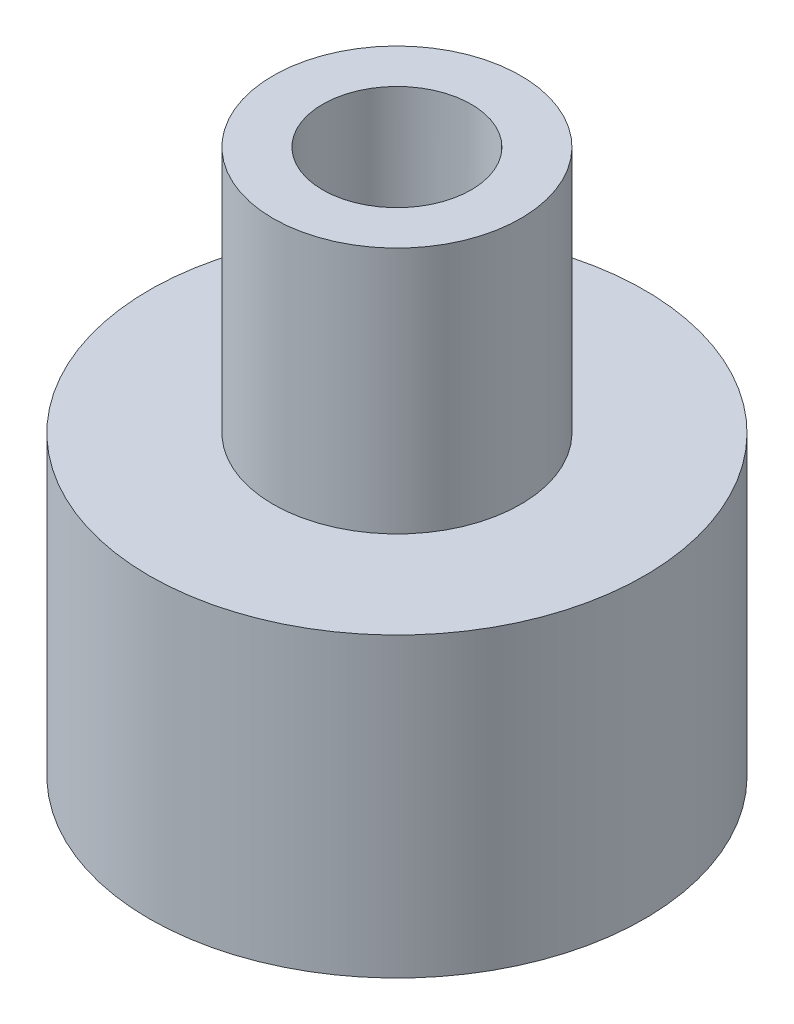
ISO-10303-21;
HEADER;
FILE_DESCRIPTION(('STEP AP214'),'2;1');
FILE_NAME('part.step','',(''),(''),'','','');
FILE_SCHEMA(('AUTOMOTIVE_DESIGN { 1 0 10303 214 1 1 1 1 }'));
ENDSEC;
DATA;
#1=APPLICATION_CONTEXT('core data for automotive mechanical design processes');
#2=APPLICATION_PROTOCOL_DEFINITION('international standard','automotive_design',2000,#1);
#3=PRODUCT_CONTEXT('',#1,'mechanical');
#4=PRODUCT('Part','Part','',(#3));
#5=PRODUCT_RELATED_PRODUCT_CATEGORY('part','',(#4));
#6=PRODUCT_DEFINITION_FORMATION('','',#4);
#7=PRODUCT_DEFINITION_CONTEXT('part definition',#1,'design');
#8=PRODUCT_DEFINITION('design','',#6,#7);
#9=PRODUCT_DEFINITION_SHAPE('','',#8);
#10=(LENGTH_UNIT() NAMED_UNIT(*) SI_UNIT(.MILLI.,.METRE.));
#11=(NAMED_UNIT(*) PLANE_ANGLE_UNIT() SI_UNIT($,.RADIAN.));
#12=(NAMED_UNIT(*) SI_UNIT($,.STERADIAN.) SOLID_ANGLE_UNIT());
#13=UNCERTAINTY_MEASURE_WITH_UNIT(LENGTH_MEASURE(1.E-05),#10,'distance_accuracy_value','');
#14=(GEOMETRIC_REPRESENTATION_CONTEXT(3) GLOBAL_UNCERTAINTY_ASSIGNED_CONTEXT((#13)) GLOBAL_UNIT_ASSIGNED_CONTEXT((#10,
#11,#12)) REPRESENTATION_CONTEXT('',''));
#15=CARTESIAN_POINT('',(0.,0.,0.));
#16=DIRECTION('',(0.,0.,1.));
#17=DIRECTION('',(1.,0.,0.));
#18=AXIS2_PLACEMENT_3D('',#15,#16,#17);
#19=CARTESIAN_POINT('',(0.,6.,0.));
#20=DIRECTION('',(0.,-1.,0.));
#21=DIRECTION('',(0.,0.,-1.));
#22=AXIS2_PLACEMENT_3D('',#19,#20,#21);
#23=CYLINDRICAL_SURFACE('',#22,5.);
#24=CARTESIAN_POINT('',(0.,6.,0.));
#25=DIRECTION('',(0.,1.,0.));
#26=DIRECTION('',(0.,0.,1.));
#27=AXIS2_PLACEMENT_3D('',#24,#25,#26);
#28=CIRCLE('',#27,5.);
#29=CARTESIAN_POINT('',(0.,6.,5.));
#30=VERTEX_POINT('',#29);
#31=EDGE_CURVE('E37',#30,#30,#28,.T.);
#32=ORIENTED_EDGE('',*,*,#31,.F.);
#33=EDGE_LOOP('',(#32));
#34=FACE_BOUND('',#33,.T.);
#35=CARTESIAN_POINT('',(0.,0.,0.));
#36=DIRECTION('',(0.,1.,0.));
#37=DIRECTION('',(0.,0.,1.));
#38=AXIS2_PLACEMENT_3D('',#35,#36,#37);
#39=CIRCLE('',#38,5.);
#40=CARTESIAN_POINT('',(0.,0.,5.));
#41=VERTEX_POINT('',#40);
#42=EDGE_CURVE('E41',#41,#41,#39,.T.);
#43=ORIENTED_EDGE('',*,*,#42,.T.);
#44=EDGE_LOOP('',(#43));
#45=FACE_BOUND('',#44,.T.);
#46=ADVANCED_FACE('F31',(#34,#45),#23,.T.);
#47=CARTESIAN_POINT('',(0.,6.,0.));
#48=DIRECTION('',(0.,1.,0.));
#49=DIRECTION('',(0.,0.,1.));
#50=AXIS2_PLACEMENT_3D('',#47,#48,#49);
#51=PLANE('',#50);
#52=CARTESIAN_POINT('',(0.,6.,0.));
#53=DIRECTION('',(0.,1.,0.));
#54=DIRECTION('',(0.,0.,1.));
#55=AXIS2_PLACEMENT_3D('',#52,#53,#54);
#56=CIRCLE('',#55,2.5);
#57=CARTESIAN_POINT('',(0.,6.,2.5));
#58=VERTEX_POINT('',#57);
#59=EDGE_CURVE('E10',#58,#58,#56,.T.);
#60=ORIENTED_EDGE('',*,*,#59,.F.);
#61=EDGE_LOOP('',(#60));
#62=FACE_BOUND('',#61,.T.);
#63=ORIENTED_EDGE('',*,*,#31,.T.);
#64=EDGE_LOOP('',(#63));
#65=FACE_BOUND('',#64,.T.);
#66=ADVANCED_FACE('F76',(#62,#65),#51,.T.);
#67=CARTESIAN_POINT('',(0.,0.,0.));
#68=DIRECTION('',(0.,1.,0.));
#69=DIRECTION('',(0.,0.,1.));
#70=AXIS2_PLACEMENT_3D('',#67,#68,#69);
#71=PLANE('',#70);
#72=CARTESIAN_POINT('',(0.,0.,0.));
#73=DIRECTION('',(0.,-1.,0.));
#74=DIRECTION('',(0.,0.,-1.));
#75=AXIS2_PLACEMENT_3D('',#72,#73,#74);
#76=CIRCLE('',#75,2.55);
#77=CARTESIAN_POINT('',(0.,0.,-2.55));
#78=VERTEX_POINT('',#77);
#79=EDGE_CURVE('E57',#78,#78,#76,.T.);
#80=ORIENTED_EDGE('',*,*,#79,.F.);
#81=EDGE_LOOP('',(#80));
#82=FACE_BOUND('',#81,.T.);
#83=ORIENTED_EDGE('',*,*,#42,.F.);
#84=EDGE_LOOP('',(#83));
#85=FACE_BOUND('',#84,.T.);
#86=ADVANCED_FACE('F72',(#82,#85),#71,.F.);
#87=CARTESIAN_POINT('',(0.,5.,0.));
#88=DIRECTION('',(0.,1.,0.));
#89=DIRECTION('',(0.,0.,1.));
#90=AXIS2_PLACEMENT_3D('',#87,#88,#89);
#91=CYLINDRICAL_SURFACE('',#90,2.5);
#92=ORIENTED_EDGE('',*,*,#59,.T.);
#93=EDGE_LOOP('',(#92));
#94=FACE_BOUND('',#93,.T.);
#95=CARTESIAN_POINT('',(0.,11.,0.));
#96=DIRECTION('',(0.,1.,0.));
#97=DIRECTION('',(0.,0.,1.));
#98=AXIS2_PLACEMENT_3D('',#95,#96,#97);
#99=CIRCLE('',#98,2.5);
#100=CARTESIAN_POINT('',(0.,11.,2.5));
#101=VERTEX_POINT('',#100);
#102=EDGE_CURVE('E46',#101,#101,#99,.T.);
#103=ORIENTED_EDGE('',*,*,#102,.F.);
#104=EDGE_LOOP('',(#103));
#105=FACE_BOUND('',#104,.T.);
#106=ADVANCED_FACE('F75',(#94,#105),#91,.T.);
#107=CARTESIAN_POINT('',(0.,11.,0.));
#108=DIRECTION('',(0.,1.,0.));
#109=DIRECTION('',(0.,0.,1.));
#110=AXIS2_PLACEMENT_3D('',#107,#108,#109);
#111=PLANE('',#110);
#112=CARTESIAN_POINT('',(0.,11.,0.));
#113=DIRECTION('',(0.,1.,0.));
#114=DIRECTION('',(0.,0.,1.));
#115=AXIS2_PLACEMENT_3D('',#112,#113,#114);
#116=CIRCLE('',#115,1.5);
#117=CARTESIAN_POINT('',(0.,11.,1.5));
#118=VERTEX_POINT('',#117);
#119=EDGE_CURVE('E50',#118,#118,#116,.T.);
#120=ORIENTED_EDGE('',*,*,#119,.F.);
#121=EDGE_LOOP('',(#120));
#122=FACE_BOUND('',#121,.T.);
#123=ORIENTED_EDGE('',*,*,#102,.T.);
#124=EDGE_LOOP('',(#123));
#125=FACE_BOUND('',#124,.T.);
#126=ADVANCED_FACE('F91',(#122,#125),#111,.T.);
#127=CARTESIAN_POINT('',(0.,5.,0.));
#128=DIRECTION('',(0.,1.,0.));
#129=DIRECTION('',(0.,0.,1.));
#130=AXIS2_PLACEMENT_3D('',#127,#128,#129);
#131=CYLINDRICAL_SURFACE('',#130,1.5);
#132=CARTESIAN_POINT('',(0.,5.,0.));
#133=DIRECTION('',(0.,-1.,0.));
#134=DIRECTION('',(0.,0.,-1.));
#135=AXIS2_PLACEMENT_3D('',#132,#133,#134);
#136=CIRCLE('',#135,1.5);
#137=CARTESIAN_POINT('',(0.,5.,-1.5));
#138=VERTEX_POINT('',#137);
#139=EDGE_CURVE('E53',#138,#138,#136,.F.);
#140=ORIENTED_EDGE('',*,*,#139,.F.);
#141=EDGE_LOOP('',(#140));
#142=FACE_BOUND('',#141,.T.);
#143=ORIENTED_EDGE('',*,*,#119,.T.);
#144=EDGE_LOOP('',(#143));
#145=FACE_BOUND('',#144,.T.);
#146=ADVANCED_FACE('F94',(#142,#145),#131,.F.);
#147=CARTESIAN_POINT('',(0.,5.,0.));
#148=DIRECTION('',(0.,-1.,0.));
#149=DIRECTION('',(0.,0.,-1.));
#150=AXIS2_PLACEMENT_3D('',#147,#148,#149);
#151=PLANE('',#150);
#152=CARTESIAN_POINT('',(0.,5.,0.));
#153=DIRECTION('',(0.,-1.,0.));
#154=DIRECTION('',(0.,0.,-1.));
#155=AXIS2_PLACEMENT_3D('',#152,#153,#154);
#156=CIRCLE('',#155,2.55);
#157=CARTESIAN_POINT('',(0.,5.,-2.55));
#158=VERTEX_POINT('',#157);
#159=EDGE_CURVE('E56',#158,#158,#156,.T.);
#160=ORIENTED_EDGE('',*,*,#159,.T.);
#161=EDGE_LOOP('',(#160));
#162=FACE_BOUND('',#161,.T.);
#163=ORIENTED_EDGE('',*,*,#139,.T.);
#164=EDGE_LOOP('',(#163));
#165=FACE_BOUND('',#164,.T.);
#166=ADVANCED_FACE('F63',(#162,#165),#151,.T.);
#167=CARTESIAN_POINT('',(0.,5.,0.));
#168=DIRECTION('',(0.,-1.,0.));
#169=DIRECTION('',(0.,0.,-1.));
#170=AXIS2_PLACEMENT_3D('',#167,#168,#169);
#171=CYLINDRICAL_SURFACE('',#170,2.55);
#172=ORIENTED_EDGE('',*,*,#159,.F.);
#173=EDGE_LOOP('',(#172));
#174=FACE_BOUND('',#173,.T.);
#175=ORIENTED_EDGE('',*,*,#79,.T.);
#176=EDGE_LOOP('',(#175));
#177=FACE_BOUND('',#176,.T.);
#178=ADVANCED_FACE('F66',(#174,#177),#171,.F.);
#179=CLOSED_SHELL('',(#46,#66,#86,#106,#126,#146,#166,#178));
#180=MANIFOLD_SOLID_BREP('B2',#179);
#181=ADVANCED_BREP_SHAPE_REPRESENTATION('',(#18,#180),#14);
#182=SHAPE_DEFINITION_REPRESENTATION(#9,#181);
ENDSEC;
END-ISO-10303-21;
